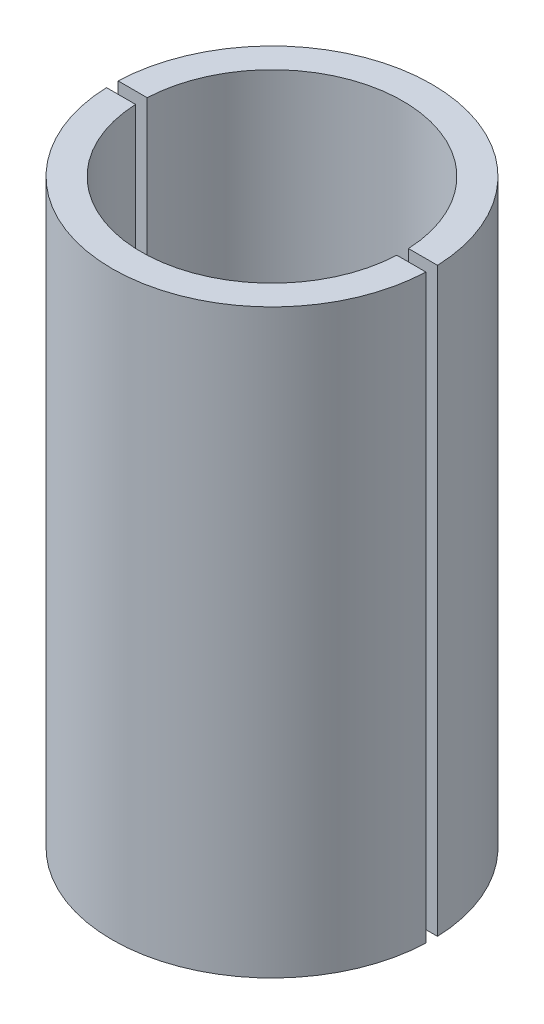
ISO-10303-21;
HEADER;
FILE_DESCRIPTION(('STEP AP214'),'2;1');
FILE_NAME('part.step','',(''),(''),'','','');
FILE_SCHEMA(('AUTOMOTIVE_DESIGN { 1 0 10303 214 1 1 1 1 }'));
ENDSEC;
DATA;
#1=APPLICATION_CONTEXT('core data for automotive mechanical design processes');
#2=APPLICATION_PROTOCOL_DEFINITION('international standard','automotive_design',2000,#1);
#3=PRODUCT_CONTEXT('',#1,'mechanical');
#4=PRODUCT('Part','Part','',(#3));
#5=PRODUCT_RELATED_PRODUCT_CATEGORY('part','',(#4));
#6=PRODUCT_DEFINITION_FORMATION('','',#4);
#7=PRODUCT_DEFINITION_CONTEXT('part definition',#1,'design');
#8=PRODUCT_DEFINITION('design','',#6,#7);
#9=PRODUCT_DEFINITION_SHAPE('','',#8);
#10=(LENGTH_UNIT() NAMED_UNIT(*) SI_UNIT(.MILLI.,.METRE.));
#11=(NAMED_UNIT(*) PLANE_ANGLE_UNIT() SI_UNIT($,.RADIAN.));
#12=(NAMED_UNIT(*) SI_UNIT($,.STERADIAN.) SOLID_ANGLE_UNIT());
#13=UNCERTAINTY_MEASURE_WITH_UNIT(LENGTH_MEASURE(1.E-05),#10,'distance_accuracy_value','');
#14=(GEOMETRIC_REPRESENTATION_CONTEXT(3) GLOBAL_UNCERTAINTY_ASSIGNED_CONTEXT((#13)) GLOBAL_UNIT_ASSIGNED_CONTEXT((#10,
#11,#12)) REPRESENTATION_CONTEXT('',''));
#15=CARTESIAN_POINT('',(0.,0.,0.));
#16=DIRECTION('',(0.,0.,1.));
#17=DIRECTION('',(1.,0.,0.));
#18=AXIS2_PLACEMENT_3D('',#15,#16,#17);
#19=CARTESIAN_POINT('',(0.,-110.603092707212,0.));
#20=DIRECTION('',(0.,-1.,0.));
#21=DIRECTION('',(0.,0.,-1.));
#22=AXIS2_PLACEMENT_3D('',#19,#20,#21);
#23=CYLINDRICAL_SURFACE('',#22,44.9999999999999);
#24=CARTESIAN_POINT('',(-44.9555335859779,100.,2.));
#25=CARTESIAN_POINT('',(-44.955533585978,70.0000000000002,2.));
#26=CARTESIAN_POINT('',(-44.955533585978,40.0000000000002,2.));
#27=CARTESIAN_POINT('',(-44.9555335859779,-8.33333333333312,2.));
#28=CARTESIAN_POINT('',(-44.9555335859779,-26.6666666666665,2.));
#29=CARTESIAN_POINT('',(-44.9555335859778,-63.3333333333332,2.));
#30=CARTESIAN_POINT('',(-44.9555335859778,-81.6666666666666,2.));
#31=CARTESIAN_POINT('',(-44.9555335859779,-100.,2.));
#32=B_SPLINE_CURVE_WITH_KNOTS('',3,(#24,#25,#26,#27,#28,#29,#30,#31),.UNSPECIFIED.,.F.,.F.,(4,2,
2,4),(0.,89.9999999999997,145.,200.),.UNSPECIFIED.);
#33=CARTESIAN_POINT('',(-44.9555335859779,100.,2.));
#34=VERTEX_POINT('',#33);
#35=CARTESIAN_POINT('',(-44.9555335859779,-100.,2.));
#36=VERTEX_POINT('',#35);
#37=EDGE_CURVE('E113',#34,#36,#32,.T.);
#38=ORIENTED_EDGE('',*,*,#37,.F.);
#39=CARTESIAN_POINT('',(0.,100.,0.));
#40=DIRECTION('',(0.,-1.,0.));
#41=DIRECTION('',(0.,0.,-1.));
#42=AXIS2_PLACEMENT_3D('',#39,#40,#41);
#43=CIRCLE('',#42,44.9999999999999);
#44=CARTESIAN_POINT('',(44.9555335859779,100.,2.));
#45=VERTEX_POINT('',#44);
#46=EDGE_CURVE('E75',#45,#34,#43,.T.);
#47=ORIENTED_EDGE('',*,*,#46,.F.);
#48=CARTESIAN_POINT('',(44.9555335859779,-100.,2.));
#49=CARTESIAN_POINT('',(44.9555335859778,-70.0000000000002,2.));
#50=CARTESIAN_POINT('',(44.9555335859778,-40.0000000000002,2.));
#51=CARTESIAN_POINT('',(44.9555335859779,8.33333333333311,2.));
#52=CARTESIAN_POINT('',(44.9555335859779,26.6666666666665,2.));
#53=CARTESIAN_POINT('',(44.9555335859779,63.3333333333332,2.));
#54=CARTESIAN_POINT('',(44.9555335859779,81.6666666666666,2.));
#55=CARTESIAN_POINT('',(44.9555335859779,100.,2.));
#56=B_SPLINE_CURVE_WITH_KNOTS('',3,(#48,#49,#50,#51,#52,#53,#54,#55),.UNSPECIFIED.,.F.,.F.,(4,2,
2,4),(0.,89.9999999999997,145.,200.),.UNSPECIFIED.);
#57=CARTESIAN_POINT('',(44.9555335859779,-100.,2.));
#58=VERTEX_POINT('',#57);
#59=EDGE_CURVE('E111',#58,#45,#56,.T.);
#60=ORIENTED_EDGE('',*,*,#59,.F.);
#61=CARTESIAN_POINT('',(0.,-100.,0.));
#62=DIRECTION('',(0.,-1.,0.));
#63=DIRECTION('',(0.,0.,-1.));
#64=AXIS2_PLACEMENT_3D('',#61,#62,#63);
#65=CIRCLE('',#64,44.9999999999999);
#66=EDGE_CURVE('E133',#58,#36,#65,.T.);
#67=ORIENTED_EDGE('',*,*,#66,.T.);
#68=EDGE_LOOP('',(#38,#47,#60,#67));
#69=FACE_BOUND('',#68,.T.);
#70=ADVANCED_FACE('F71',(#69),#23,.F.);
#71=CARTESIAN_POINT('',(44.9999999999999,-100.,0.));
#72=DIRECTION('',(0.,-1.,0.));
#73=DIRECTION('',(0.,0.,-1.));
#74=AXIS2_PLACEMENT_3D('',#71,#72,#73);
#75=PLANE('',#74);
#76=DIRECTION('',(-1.,0.,0.));
#77=VECTOR('',#76,1.);
#78=CARTESIAN_POINT('',(44.9999999999999,-100.,2.));
#79=LINE('',#78,#77);
#80=CARTESIAN_POINT('',(54.963624334645,-100.,2.));
#81=VERTEX_POINT('',#80);
#82=EDGE_CURVE('E123',#81,#58,#79,.T.);
#83=ORIENTED_EDGE('',*,*,#82,.F.);
#84=CARTESIAN_POINT('',(0.,-100.,0.));
#85=DIRECTION('',(0.,-1.,0.));
#86=DIRECTION('',(0.,0.,-1.));
#87=AXIS2_PLACEMENT_3D('',#84,#85,#86);
#88=CIRCLE('',#87,54.9999999999999);
#89=CARTESIAN_POINT('',(-54.963624334645,-100.,2.));
#90=VERTEX_POINT('',#89);
#91=EDGE_CURVE('E128',#81,#90,#88,.T.);
#92=ORIENTED_EDGE('',*,*,#91,.T.);
#93=EDGE_CURVE('E115',#36,#90,#79,.T.);
#94=ORIENTED_EDGE('',*,*,#93,.F.);
#95=ORIENTED_EDGE('',*,*,#66,.F.);
#96=EDGE_LOOP('',(#83,#92,#94,#95));
#97=FACE_BOUND('',#96,.T.);
#98=ADVANCED_FACE('F132',(#97),#75,.T.);
#99=CARTESIAN_POINT('',(0.,-110.603092707212,0.));
#100=DIRECTION('',(0.,-1.,0.));
#101=DIRECTION('',(0.,0.,-1.));
#102=AXIS2_PLACEMENT_3D('',#99,#100,#101);
#103=CYLINDRICAL_SURFACE('',#102,54.9999999999999);
#104=CARTESIAN_POINT('',(54.963624334645,100.,2.));
#105=CARTESIAN_POINT('',(54.963624334645,81.6666666666667,2.));
#106=CARTESIAN_POINT('',(54.963624334645,63.3333333333334,2.));
#107=CARTESIAN_POINT('',(54.9636243346451,26.6666666666669,2.));
#108=CARTESIAN_POINT('',(54.9636243346451,8.33333333333359,2.));
#109=CARTESIAN_POINT('',(54.9636243346451,-39.9999999999998,2.));
#110=CARTESIAN_POINT('',(54.9636243346451,-69.9999999999999,2.));
#111=CARTESIAN_POINT('',(54.9636243346451,-100.,2.));
#112=B_SPLINE_CURVE_WITH_KNOTS('',3,(#104,#105,#106,#107,#108,#109,#110,#111),.UNSPECIFIED.,.F.,
.F.,(4,2,2,4),(0.,54.9999999999999,110.,200.),.UNSPECIFIED.);
#113=CARTESIAN_POINT('',(54.963624334645,100.,2.));
#114=VERTEX_POINT('',#113);
#115=EDGE_CURVE('E104',#114,#81,#112,.T.);
#116=ORIENTED_EDGE('',*,*,#115,.F.);
#117=CARTESIAN_POINT('',(0.,100.,0.));
#118=DIRECTION('',(0.,-1.,0.));
#119=DIRECTION('',(0.,0.,-1.));
#120=AXIS2_PLACEMENT_3D('',#117,#118,#119);
#121=CIRCLE('',#120,54.9999999999999);
#122=CARTESIAN_POINT('',(-54.963624334645,100.,2.));
#123=VERTEX_POINT('',#122);
#124=EDGE_CURVE('E130',#114,#123,#121,.T.);
#125=ORIENTED_EDGE('',*,*,#124,.T.);
#126=CARTESIAN_POINT('',(-54.963624334645,-100.,2.));
#127=CARTESIAN_POINT('',(-54.963624334645,-81.6666666666667,2.));
#128=CARTESIAN_POINT('',(-54.963624334645,-63.3333333333334,2.));
#129=CARTESIAN_POINT('',(-54.963624334645,-26.6666666666669,2.));
#130=CARTESIAN_POINT('',(-54.963624334645,-8.33333333333358,2.));
#131=CARTESIAN_POINT('',(-54.963624334645,39.9999999999998,2.));
#132=CARTESIAN_POINT('',(-54.963624334645,69.9999999999999,2.));
#133=CARTESIAN_POINT('',(-54.963624334645,100.,2.));
#134=B_SPLINE_CURVE_WITH_KNOTS('',3,(#126,#127,#128,#129,#130,#131,#132,#133),.UNSPECIFIED.,.F.,
.F.,(4,2,2,4),(0.,54.9999999999999,110.,200.),.UNSPECIFIED.);
#135=EDGE_CURVE('E81',#90,#123,#134,.T.);
#136=ORIENTED_EDGE('',*,*,#135,.F.);
#137=ORIENTED_EDGE('',*,*,#91,.F.);
#138=EDGE_LOOP('',(#116,#125,#136,#137));
#139=FACE_BOUND('',#138,.T.);
#140=ADVANCED_FACE('F127',(#139),#103,.T.);
#141=CARTESIAN_POINT('',(44.9999999999999,100.,0.));
#142=DIRECTION('',(0.,1.,0.));
#143=DIRECTION('',(0.,0.,1.));
#144=AXIS2_PLACEMENT_3D('',#141,#142,#143);
#145=PLANE('',#144);
#146=DIRECTION('',(1.,0.,0.));
#147=VECTOR('',#146,1.);
#148=CARTESIAN_POINT('',(44.9999999999999,100.,2.));
#149=LINE('',#148,#147);
#150=EDGE_CURVE('E14',#123,#34,#149,.T.);
#151=ORIENTED_EDGE('',*,*,#150,.F.);
#152=ORIENTED_EDGE('',*,*,#124,.F.);
#153=EDGE_CURVE('E83',#45,#114,#149,.T.);
#154=ORIENTED_EDGE('',*,*,#153,.F.);
#155=ORIENTED_EDGE('',*,*,#46,.T.);
#156=EDGE_LOOP('',(#151,#152,#154,#155));
#157=FACE_BOUND('',#156,.T.);
#158=ADVANCED_FACE('F149',(#157),#145,.T.);
#159=CARTESIAN_POINT('',(75.3576608251327,-108.655231887401,0.));
#160=CARTESIAN_POINT('',(28.5180154073969,-108.655231887401,0.));
#161=CARTESIAN_POINT('',(-18.3216300103388,-108.655231887401,0.));
#162=CARTESIAN_POINT('',(-65.1612754280746,-108.655231887401,0.));
#163=CARTESIAN_POINT('',(75.3576608251327,-37.1743217601078,0.));
#164=CARTESIAN_POINT('',(28.5180154073969,-37.1743217601078,0.));
#165=CARTESIAN_POINT('',(-18.3216300103388,-37.1743217601078,0.));
#166=CARTESIAN_POINT('',(-65.1612754280746,-37.1743217601078,0.));
#167=CARTESIAN_POINT('',(75.3576608251327,34.3065883671852,0.));
#168=CARTESIAN_POINT('',(28.5180154073969,34.3065883671852,0.));
#169=CARTESIAN_POINT('',(-18.3216300103388,34.3065883671852,0.));
#170=CARTESIAN_POINT('',(-65.1612754280746,34.3065883671852,0.));
#171=CARTESIAN_POINT('',(75.3576608251327,105.787498494478,0.));
#172=CARTESIAN_POINT('',(28.5180154073969,105.787498494478,0.));
#173=CARTESIAN_POINT('',(-18.3216300103388,105.787498494478,0.));
#174=CARTESIAN_POINT('',(-65.1612754280746,105.787498494478,0.));
#175=B_SPLINE_SURFACE_WITH_KNOTS('',3,3,((#159,#160,#161,#162),(#163,#164,#165,#166),(#167,#168,
#169,#170),(#171,#172,#173,#174)),.UNSPECIFIED.,.F.,.F.,.F.,(4,4),(4,4),(0.,1.),(0.,1.),.UNSPECIFIED.);
#176=OFFSET_SURFACE('',#175,2.,.F.);
#177=ORIENTED_EDGE('',*,*,#59,.T.);
#178=ORIENTED_EDGE('',*,*,#153,.T.);
#179=ORIENTED_EDGE('',*,*,#115,.T.);
#180=ORIENTED_EDGE('',*,*,#82,.T.);
#181=EDGE_LOOP('',(#177,#178,#179,#180));
#182=FACE_BOUND('',#181,.T.);
#183=ADVANCED_FACE('F145',(#182),#176,.F.);
#184=ORIENTED_EDGE('',*,*,#37,.T.);
#185=ORIENTED_EDGE('',*,*,#93,.T.);
#186=ORIENTED_EDGE('',*,*,#135,.T.);
#187=ORIENTED_EDGE('',*,*,#150,.T.);
#188=EDGE_LOOP('',(#184,#185,#186,#187));
#189=FACE_BOUND('',#188,.T.);
#190=ADVANCED_FACE('F117',(#189),#176,.F.);
#191=CLOSED_SHELL('',(#70,#98,#140,#158,#183,#190));
#192=MANIFOLD_SOLID_BREP('B2',#191);
#193=CARTESIAN_POINT('',(44.9999999999999,100.,0.));
#194=DIRECTION('',(0.,1.,0.));
#195=DIRECTION('',(0.,0.,1.));
#196=AXIS2_PLACEMENT_3D('',#193,#194,#195);
#197=PLANE('',#196);
#198=CARTESIAN_POINT('',(0.,100.,0.));
#199=DIRECTION('',(0.,-1.,0.));
#200=DIRECTION('',(0.,0.,-1.));
#201=AXIS2_PLACEMENT_3D('',#198,#199,#200);
#202=CIRCLE('',#201,54.9999999999999);
#203=CARTESIAN_POINT('',(-54.963624334645,100.,-2.));
#204=VERTEX_POINT('',#203);
#205=CARTESIAN_POINT('',(54.963624334645,100.,-2.));
#206=VERTEX_POINT('',#205);
#207=EDGE_CURVE('E276',#204,#206,#202,.T.);
#208=ORIENTED_EDGE('',*,*,#207,.F.);
#209=DIRECTION('',(1.,0.,0.));
#210=VECTOR('',#209,1.);
#211=CARTESIAN_POINT('',(44.9999999999999,100.,-2.));
#212=LINE('',#211,#210);
#213=CARTESIAN_POINT('',(-44.9555335859779,100.,-2.));
#214=VERTEX_POINT('',#213);
#215=EDGE_CURVE('E69',#204,#214,#212,.T.);
#216=ORIENTED_EDGE('',*,*,#215,.T.);
#217=CARTESIAN_POINT('',(0.,100.,0.));
#218=DIRECTION('',(0.,-1.,0.));
#219=DIRECTION('',(0.,0.,-1.));
#220=AXIS2_PLACEMENT_3D('',#217,#218,#219);
#221=CIRCLE('',#220,44.9999999999999);
#222=CARTESIAN_POINT('',(44.9555335859779,100.,-2.));
#223=VERTEX_POINT('',#222);
#224=EDGE_CURVE('E271',#214,#223,#221,.T.);
#225=ORIENTED_EDGE('',*,*,#224,.T.);
#226=EDGE_CURVE('E226',#223,#206,#212,.T.);
#227=ORIENTED_EDGE('',*,*,#226,.T.);
#228=EDGE_LOOP('',(#208,#216,#225,#227));
#229=FACE_BOUND('',#228,.T.);
#230=ADVANCED_FACE('F221',(#229),#197,.T.);
#231=CARTESIAN_POINT('',(0.,-110.603092707212,0.));
#232=DIRECTION('',(0.,-1.,0.));
#233=DIRECTION('',(0.,0.,-1.));
#234=AXIS2_PLACEMENT_3D('',#231,#232,#233);
#235=CYLINDRICAL_SURFACE('',#234,54.9999999999999);
#236=ORIENTED_EDGE('',*,*,#207,.T.);
#237=CARTESIAN_POINT('',(54.963624334645,100.,-2.));
#238=CARTESIAN_POINT('',(54.963624334645,81.6666666666667,-2.));
#239=CARTESIAN_POINT('',(54.963624334645,63.3333333333334,-2.));
#240=CARTESIAN_POINT('',(54.963624334645,26.6666666666669,-2.));
#241=CARTESIAN_POINT('',(54.963624334645,8.33333333333358,-2.));
#242=CARTESIAN_POINT('',(54.963624334645,-39.9999999999998,-2.));
#243=CARTESIAN_POINT('',(54.963624334645,-69.9999999999999,-2.));
#244=CARTESIAN_POINT('',(54.963624334645,-100.,-2.));
#245=B_SPLINE_CURVE_WITH_KNOTS('',3,(#237,#238,#239,#240,#241,#242,#243,#244),.UNSPECIFIED.,.F.,
.F.,(4,2,2,4),(0.,54.9999999999999,110.,200.),.UNSPECIFIED.);
#246=CARTESIAN_POINT('',(54.963624334645,-100.,-2.));
#247=VERTEX_POINT('',#246);
#248=EDGE_CURVE('E237',#206,#247,#245,.T.);
#249=ORIENTED_EDGE('',*,*,#248,.T.);
#250=CARTESIAN_POINT('',(0.,-100.,0.));
#251=DIRECTION('',(0.,-1.,0.));
#252=DIRECTION('',(0.,0.,-1.));
#253=AXIS2_PLACEMENT_3D('',#250,#251,#252);
#254=CIRCLE('',#253,54.9999999999999);
#255=CARTESIAN_POINT('',(-54.963624334645,-100.,-1.99999999999999));
#256=VERTEX_POINT('',#255);
#257=EDGE_CURVE('E278',#256,#247,#254,.T.);
#258=ORIENTED_EDGE('',*,*,#257,.F.);
#259=CARTESIAN_POINT('',(-54.963624334645,-100.,-1.99999999999999));
#260=CARTESIAN_POINT('',(-54.963624334645,-81.6666666666667,-2.));
#261=CARTESIAN_POINT('',(-54.963624334645,-63.3333333333334,-2.));
#262=CARTESIAN_POINT('',(-54.963624334645,-26.6666666666669,-2.));
#263=CARTESIAN_POINT('',(-54.963624334645,-8.33333333333358,-2.));
#264=CARTESIAN_POINT('',(-54.963624334645,39.9999999999998,-2.));
#265=CARTESIAN_POINT('',(-54.963624334645,69.9999999999999,-2.));
#266=CARTESIAN_POINT('',(-54.963624334645,100.,-2.));
#267=B_SPLINE_CURVE_WITH_KNOTS('',3,(#259,#260,#261,#262,#263,#264,#265,#266),.UNSPECIFIED.,.F.,
.F.,(4,2,2,4),(0.,54.9999999999999,110.,200.),.UNSPECIFIED.);
#268=EDGE_CURVE('E273',#256,#204,#267,.T.);
#269=ORIENTED_EDGE('',*,*,#268,.T.);
#270=EDGE_LOOP('',(#236,#249,#258,#269));
#271=FACE_BOUND('',#270,.T.);
#272=ADVANCED_FACE('F295',(#271),#235,.T.);
#273=CARTESIAN_POINT('',(44.9999999999999,-100.,0.));
#274=DIRECTION('',(0.,-1.,0.));
#275=DIRECTION('',(0.,0.,-1.));
#276=AXIS2_PLACEMENT_3D('',#273,#274,#275);
#277=PLANE('',#276);
#278=ORIENTED_EDGE('',*,*,#257,.T.);
#279=DIRECTION('',(-1.,0.,0.));
#280=VECTOR('',#279,1.);
#281=CARTESIAN_POINT('',(44.9999999999999,-100.,-2.));
#282=LINE('',#281,#280);
#283=CARTESIAN_POINT('',(44.9555335859779,-100.,-2.));
#284=VERTEX_POINT('',#283);
#285=EDGE_CURVE('E274',#247,#284,#282,.T.);
#286=ORIENTED_EDGE('',*,*,#285,.T.);
#287=CARTESIAN_POINT('',(0.,-100.,0.));
#288=DIRECTION('',(0.,-1.,0.));
#289=DIRECTION('',(0.,0.,-1.));
#290=AXIS2_PLACEMENT_3D('',#287,#288,#289);
#291=CIRCLE('',#290,44.9999999999999);
#292=CARTESIAN_POINT('',(-44.9555335859779,-100.,-2.));
#293=VERTEX_POINT('',#292);
#294=EDGE_CURVE('E267',#293,#284,#291,.T.);
#295=ORIENTED_EDGE('',*,*,#294,.F.);
#296=EDGE_CURVE('E280',#293,#256,#282,.T.);
#297=ORIENTED_EDGE('',*,*,#296,.T.);
#298=EDGE_LOOP('',(#278,#286,#295,#297));
#299=FACE_BOUND('',#298,.T.);
#300=ADVANCED_FACE('F292',(#299),#277,.T.);
#301=CARTESIAN_POINT('',(0.,-110.603092707212,0.));
#302=DIRECTION('',(0.,-1.,0.));
#303=DIRECTION('',(0.,0.,-1.));
#304=AXIS2_PLACEMENT_3D('',#301,#302,#303);
#305=CYLINDRICAL_SURFACE('',#304,44.9999999999999);
#306=ORIENTED_EDGE('',*,*,#224,.F.);
#307=CARTESIAN_POINT('',(-44.9555335859779,100.,-2.00000000000001));
#308=CARTESIAN_POINT('',(-44.9555335859779,70.0000000000001,-2.));
#309=CARTESIAN_POINT('',(-44.9555335859779,40.0000000000002,-2.));
#310=CARTESIAN_POINT('',(-44.9555335859779,-8.33333333333308,-2.));
#311=CARTESIAN_POINT('',(-44.9555335859779,-26.6666666666665,-2.));
#312=CARTESIAN_POINT('',(-44.9555335859779,-63.3333333333332,-2.));
#313=CARTESIAN_POINT('',(-44.9555335859779,-81.6666666666666,-2.));
#314=CARTESIAN_POINT('',(-44.9555335859779,-100.,-2.));
#315=B_SPLINE_CURVE_WITH_KNOTS('',3,(#307,#308,#309,#310,#311,#312,#313,#314),.UNSPECIFIED.,.F.,
.F.,(4,2,2,4),(0.,89.9999999999997,145.,200.),.UNSPECIFIED.);
#316=EDGE_CURVE('E245',#214,#293,#315,.T.);
#317=ORIENTED_EDGE('',*,*,#316,.T.);
#318=ORIENTED_EDGE('',*,*,#294,.T.);
#319=CARTESIAN_POINT('',(44.9555335859779,-100.,-2.));
#320=CARTESIAN_POINT('',(44.9555335859779,-70.0000000000001,-2.));
#321=CARTESIAN_POINT('',(44.9555335859779,-40.0000000000002,-2.));
#322=CARTESIAN_POINT('',(44.9555335859779,8.33333333333311,-2.));
#323=CARTESIAN_POINT('',(44.9555335859779,26.6666666666665,-2.));
#324=CARTESIAN_POINT('',(44.9555335859779,63.3333333333332,-2.));
#325=CARTESIAN_POINT('',(44.9555335859779,81.6666666666666,-2.));
#326=CARTESIAN_POINT('',(44.9555335859779,100.,-2.));
#327=B_SPLINE_CURVE_WITH_KNOTS('',3,(#319,#320,#321,#322,#323,#324,#325,#326),.UNSPECIFIED.,.F.,
.F.,(4,2,2,4),(0.,89.9999999999997,145.,200.),.UNSPECIFIED.);
#328=EDGE_CURVE('E261',#284,#223,#327,.T.);
#329=ORIENTED_EDGE('',*,*,#328,.T.);
#330=EDGE_LOOP('',(#306,#317,#318,#329));
#331=FACE_BOUND('',#330,.T.);
#332=ADVANCED_FACE('F223',(#331),#305,.F.);
#333=CARTESIAN_POINT('',(75.3576608251327,-108.655231887401,0.));
#334=CARTESIAN_POINT('',(28.5180154073969,-108.655231887401,0.));
#335=CARTESIAN_POINT('',(-18.3216300103388,-108.655231887401,0.));
#336=CARTESIAN_POINT('',(-65.1612754280746,-108.655231887401,0.));
#337=CARTESIAN_POINT('',(75.3576608251327,-37.1743217601078,0.));
#338=CARTESIAN_POINT('',(28.5180154073969,-37.1743217601078,0.));
#339=CARTESIAN_POINT('',(-18.3216300103388,-37.1743217601078,0.));
#340=CARTESIAN_POINT('',(-65.1612754280746,-37.1743217601078,0.));
#341=CARTESIAN_POINT('',(75.3576608251327,34.3065883671852,0.));
#342=CARTESIAN_POINT('',(28.5180154073969,34.3065883671852,0.));
#343=CARTESIAN_POINT('',(-18.3216300103388,34.3065883671852,0.));
#344=CARTESIAN_POINT('',(-65.1612754280746,34.3065883671852,0.));
#345=CARTESIAN_POINT('',(75.3576608251327,105.787498494478,0.));
#346=CARTESIAN_POINT('',(28.5180154073969,105.787498494478,0.));
#347=CARTESIAN_POINT('',(-18.3216300103388,105.787498494478,0.));
#348=CARTESIAN_POINT('',(-65.1612754280746,105.787498494478,0.));
#349=B_SPLINE_SURFACE_WITH_KNOTS('',3,3,((#333,#334,#335,#336),(#337,#338,#339,#340),(#341,#342,
#343,#344),(#345,#346,#347,#348)),.UNSPECIFIED.,.F.,.F.,.F.,(4,4),(4,4),(0.,1.),(0.,1.),.UNSPECIFIED.);
#350=OFFSET_SURFACE('',#349,-2.,.F.);
#351=ORIENTED_EDGE('',*,*,#285,.F.);
#352=ORIENTED_EDGE('',*,*,#248,.F.);
#353=ORIENTED_EDGE('',*,*,#226,.F.);
#354=ORIENTED_EDGE('',*,*,#328,.F.);
#355=EDGE_LOOP('',(#351,#352,#353,#354));
#356=FACE_BOUND('',#355,.T.);
#357=ADVANCED_FACE('F260',(#356),#350,.T.);
#358=ORIENTED_EDGE('',*,*,#215,.F.);
#359=ORIENTED_EDGE('',*,*,#268,.F.);
#360=ORIENTED_EDGE('',*,*,#296,.F.);
#361=ORIENTED_EDGE('',*,*,#316,.F.);
#362=EDGE_LOOP('',(#358,#359,#360,#361));
#363=FACE_BOUND('',#362,.T.);
#364=ADVANCED_FACE('F307',(#363),#350,.T.);
#365=CLOSED_SHELL('',(#230,#272,#300,#332,#357,#364));
#366=MANIFOLD_SOLID_BREP('B8',#365);
#367=ADVANCED_BREP_SHAPE_REPRESENTATION('',(#18,#192,#366),#14);
#368=SHAPE_DEFINITION_REPRESENTATION(#9,#367);
ENDSEC;
END-ISO-10303-21;
